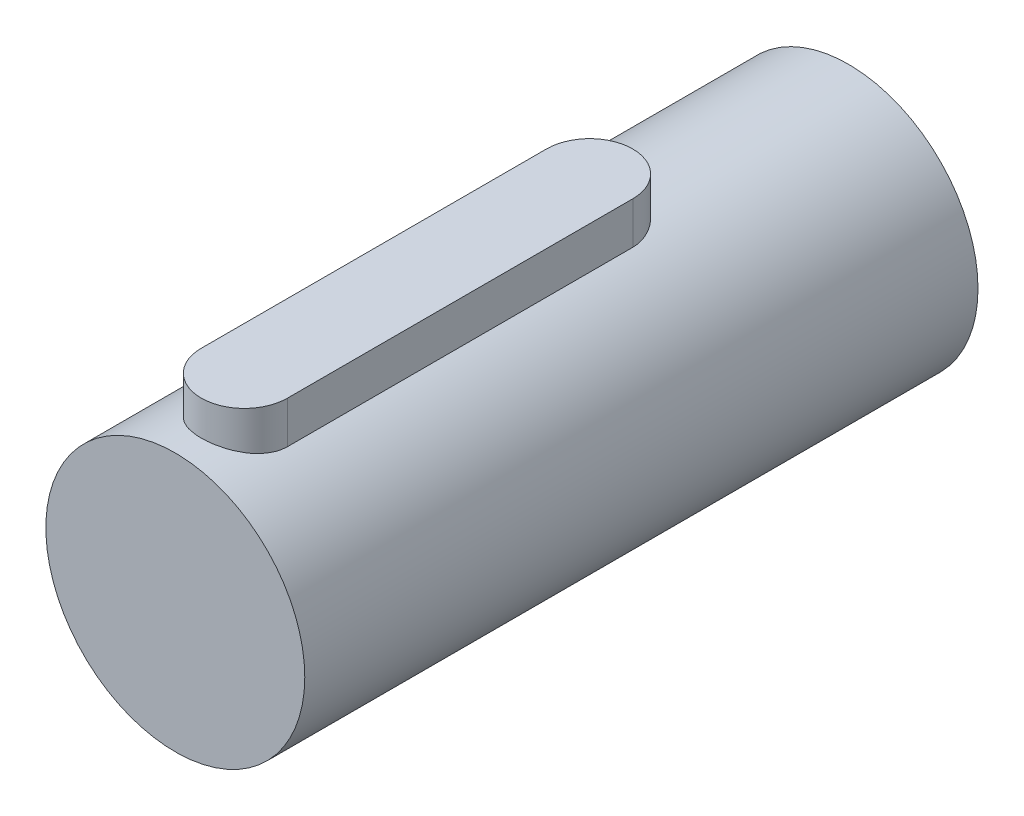
ISO-10303-21;
HEADER;
FILE_DESCRIPTION(('STEP AP214'),'2;1');
FILE_NAME('part.step','',(''),(''),'','','');
FILE_SCHEMA(('AUTOMOTIVE_DESIGN { 1 0 10303 214 1 1 1 1 }'));
ENDSEC;
DATA;
#1=APPLICATION_CONTEXT('core data for automotive mechanical design processes');
#2=APPLICATION_PROTOCOL_DEFINITION('international standard','automotive_design',2000,#1);
#3=PRODUCT_CONTEXT('',#1,'mechanical');
#4=PRODUCT('Part','Part','',(#3));
#5=PRODUCT_RELATED_PRODUCT_CATEGORY('part','',(#4));
#6=PRODUCT_DEFINITION_FORMATION('','',#4);
#7=PRODUCT_DEFINITION_CONTEXT('part definition',#1,'design');
#8=PRODUCT_DEFINITION('design','',#6,#7);
#9=PRODUCT_DEFINITION_SHAPE('','',#8);
#10=(LENGTH_UNIT() NAMED_UNIT(*) SI_UNIT(.MILLI.,.METRE.));
#11=(NAMED_UNIT(*) PLANE_ANGLE_UNIT() SI_UNIT($,.RADIAN.));
#12=(NAMED_UNIT(*) SI_UNIT($,.STERADIAN.) SOLID_ANGLE_UNIT());
#13=UNCERTAINTY_MEASURE_WITH_UNIT(LENGTH_MEASURE(1.E-05),#10,'distance_accuracy_value','');
#14=(GEOMETRIC_REPRESENTATION_CONTEXT(3) GLOBAL_UNCERTAINTY_ASSIGNED_CONTEXT((#13)) GLOBAL_UNIT_ASSIGNED_CONTEXT((#10,
#11,#12)) REPRESENTATION_CONTEXT('',''));
#15=CARTESIAN_POINT('',(0.,0.,0.));
#16=DIRECTION('',(0.,0.,1.));
#17=DIRECTION('',(1.,0.,0.));
#18=AXIS2_PLACEMENT_3D('',#15,#16,#17);
#19=CARTESIAN_POINT('',(1.31838984174237E-13,4.4999999999999,-24.));
#20=DIRECTION('',(0.,1.,0.));
#21=DIRECTION('',(0.,0.,0.999999999999998));
#22=AXIS2_PLACEMENT_3D('',#19,#20,#21);
#23=CYLINDRICAL_SURFACE('',#22,2.5);
#24=CARTESIAN_POINT('',(0.,9.49999999999996,-24.));
#25=DIRECTION('',(0.,1.,0.));
#26=DIRECTION('',(0.,0.,0.999999999999998));
#27=AXIS2_PLACEMENT_3D('',#24,#25,#26);
#28=CIRCLE('',#27,2.5);
#29=CARTESIAN_POINT('',(2.50000000000017,9.4999999999999,-24.));
#30=VERTEX_POINT('',#29);
#31=CARTESIAN_POINT('',(-2.49999999999999,9.49999999999999,-24.));
#32=VERTEX_POINT('',#31);
#33=EDGE_CURVE('E120',#30,#32,#28,.T.);
#34=ORIENTED_EDGE('',*,*,#33,.F.);
#35=DIRECTION('',(0.,1.,0.));
#36=VECTOR('',#35,1.);
#37=CARTESIAN_POINT('',(2.50000000000003,4.49999999999995,-24.));
#38=LINE('',#37,#36);
#39=CARTESIAN_POINT('',(2.50000000000003,4.49999999999995,-24.));
#40=VERTEX_POINT('',#39);
#41=EDGE_CURVE('E12',#40,#30,#38,.T.);
#42=ORIENTED_EDGE('',*,*,#41,.F.);
#43=CARTESIAN_POINT('',(1.31838984174237E-13,4.4999999999999,-24.));
#44=DIRECTION('',(0.,1.,0.));
#45=DIRECTION('',(0.,0.,0.999999999999998));
#46=AXIS2_PLACEMENT_3D('',#43,#44,#45);
#47=CIRCLE('',#46,2.5);
#48=CARTESIAN_POINT('',(-2.49999999999986,4.49999999999995,-24.));
#49=VERTEX_POINT('',#48);
#50=EDGE_CURVE('E111',#40,#49,#47,.T.);
#51=ORIENTED_EDGE('',*,*,#50,.T.);
#52=DIRECTION('',(0.,1.,0.));
#53=VECTOR('',#52,1.);
#54=CARTESIAN_POINT('',(-2.49999999999986,4.49999999999995,-24.));
#55=LINE('',#54,#53);
#56=EDGE_CURVE('E52',#49,#32,#55,.T.);
#57=ORIENTED_EDGE('',*,*,#56,.T.);
#58=EDGE_LOOP('',(#34,#42,#51,#57));
#59=FACE_BOUND('',#58,.T.);
#60=ADVANCED_FACE('F49',(#59),#23,.T.);
#61=CARTESIAN_POINT('',(2.50000000000003,4.49999999999995,-24.));
#62=DIRECTION('',(1.,0.,0.));
#63=DIRECTION('',(0.,0.,-0.999999999999998));
#64=AXIS2_PLACEMENT_3D('',#61,#62,#63);
#65=PLANE('',#64);
#66=DIRECTION('',(0.,0.,-0.999999999999998));
#67=VECTOR('',#66,1.);
#68=CARTESIAN_POINT('',(2.50000000000017,9.4999999999999,-24.));
#69=LINE('',#68,#67);
#70=CARTESIAN_POINT('',(2.49999999999996,9.49999999999993,-4.00000000000003));
#71=VERTEX_POINT('',#70);
#72=EDGE_CURVE('E115',#71,#30,#69,.T.);
#73=ORIENTED_EDGE('',*,*,#72,.F.);
#74=DIRECTION('',(0.,1.,0.));
#75=VECTOR('',#74,1.);
#76=CARTESIAN_POINT('',(2.50000000000013,4.49999999999995,-4.));
#77=LINE('',#76,#75);
#78=CARTESIAN_POINT('',(2.50000000000013,4.49999999999995,-4.));
#79=VERTEX_POINT('',#78);
#80=EDGE_CURVE('E59',#79,#71,#77,.T.);
#81=ORIENTED_EDGE('',*,*,#80,.F.);
#82=DIRECTION('',(0.,0.,-0.999999999999998));
#83=VECTOR('',#82,1.);
#84=CARTESIAN_POINT('',(2.50000000000003,4.49999999999995,-24.));
#85=LINE('',#84,#83);
#86=EDGE_CURVE('E106',#79,#40,#85,.T.);
#87=ORIENTED_EDGE('',*,*,#86,.T.);
#88=ORIENTED_EDGE('',*,*,#41,.T.);
#89=EDGE_LOOP('',(#73,#81,#87,#88));
#90=FACE_BOUND('',#89,.T.);
#91=ADVANCED_FACE('F142',(#90),#65,.T.);
#92=CARTESIAN_POINT('',(0.,4.49999999999992,-4.00000000000006));
#93=DIRECTION('',(0.,1.,0.));
#94=DIRECTION('',(0.,0.,0.999999999999998));
#95=AXIS2_PLACEMENT_3D('',#92,#93,#94);
#96=CYLINDRICAL_SURFACE('',#95,2.5);
#97=CARTESIAN_POINT('',(0.,9.49999999999998,-4.00000000000006));
#98=DIRECTION('',(0.,1.,0.));
#99=DIRECTION('',(0.,0.,0.999999999999998));
#100=AXIS2_PLACEMENT_3D('',#97,#98,#99);
#101=CIRCLE('',#100,2.5);
#102=CARTESIAN_POINT('',(-2.49999999999997,9.50000000000001,-4.00000000000006));
#103=VERTEX_POINT('',#102);
#104=EDGE_CURVE('E100',#103,#71,#101,.T.);
#105=ORIENTED_EDGE('',*,*,#104,.F.);
#106=DIRECTION('',(0.,1.,0.));
#107=VECTOR('',#106,1.);
#108=CARTESIAN_POINT('',(-2.49999999999998,4.50000000000001,-4.));
#109=LINE('',#108,#107);
#110=CARTESIAN_POINT('',(-2.49999999999998,4.50000000000001,-4.));
#111=VERTEX_POINT('',#110);
#112=EDGE_CURVE('E95',#111,#103,#109,.T.);
#113=ORIENTED_EDGE('',*,*,#112,.F.);
#114=CARTESIAN_POINT('',(0.,4.49999999999992,-4.00000000000006));
#115=DIRECTION('',(0.,1.,0.));
#116=DIRECTION('',(0.,0.,0.999999999999998));
#117=AXIS2_PLACEMENT_3D('',#114,#115,#116);
#118=CIRCLE('',#117,2.5);
#119=EDGE_CURVE('E98',#111,#79,#118,.T.);
#120=ORIENTED_EDGE('',*,*,#119,.T.);
#121=ORIENTED_EDGE('',*,*,#80,.T.);
#122=EDGE_LOOP('',(#105,#113,#120,#121));
#123=FACE_BOUND('',#122,.T.);
#124=ADVANCED_FACE('F97',(#123),#96,.T.);
#125=CARTESIAN_POINT('',(-2.49999999999986,4.49999999999995,-24.));
#126=DIRECTION('',(-1.,0.,0.));
#127=DIRECTION('',(0.,0.,0.999999999999998));
#128=AXIS2_PLACEMENT_3D('',#125,#126,#127);
#129=PLANE('',#128);
#130=DIRECTION('',(0.,0.,0.999999999999998));
#131=VECTOR('',#130,1.);
#132=CARTESIAN_POINT('',(-2.49999999999999,9.49999999999999,-24.));
#133=LINE('',#132,#131);
#134=EDGE_CURVE('E124',#32,#103,#133,.T.);
#135=ORIENTED_EDGE('',*,*,#134,.F.);
#136=ORIENTED_EDGE('',*,*,#56,.F.);
#137=DIRECTION('',(0.,0.,0.999999999999998));
#138=VECTOR('',#137,1.);
#139=CARTESIAN_POINT('',(-2.49999999999986,4.49999999999995,-24.));
#140=LINE('',#139,#138);
#141=EDGE_CURVE('E105',#49,#111,#140,.T.);
#142=ORIENTED_EDGE('',*,*,#141,.T.);
#143=ORIENTED_EDGE('',*,*,#112,.T.);
#144=EDGE_LOOP('',(#135,#136,#142,#143));
#145=FACE_BOUND('',#144,.T.);
#146=ADVANCED_FACE('F109',(#145),#129,.T.);
#147=CARTESIAN_POINT('',(1.31838984174237E-13,4.4999999999999,-24.));
#148=DIRECTION('',(0.,1.,0.));
#149=DIRECTION('',(0.,0.,0.999999999999998));
#150=AXIS2_PLACEMENT_3D('',#147,#148,#149);
#151=PLANE('',#150);
#152=ORIENTED_EDGE('',*,*,#50,.F.);
#153=ORIENTED_EDGE('',*,*,#86,.F.);
#154=ORIENTED_EDGE('',*,*,#119,.F.);
#155=ORIENTED_EDGE('',*,*,#141,.F.);
#156=EDGE_LOOP('',(#152,#153,#154,#155));
#157=FACE_BOUND('',#156,.T.);
#158=ADVANCED_FACE('F104',(#157),#151,.F.);
#159=CARTESIAN_POINT('',(0.,9.49999999999996,-24.));
#160=DIRECTION('',(0.,1.,0.));
#161=DIRECTION('',(0.,0.,0.999999999999998));
#162=AXIS2_PLACEMENT_3D('',#159,#160,#161);
#163=PLANE('',#162);
#164=ORIENTED_EDGE('',*,*,#33,.T.);
#165=ORIENTED_EDGE('',*,*,#134,.T.);
#166=ORIENTED_EDGE('',*,*,#104,.T.);
#167=ORIENTED_EDGE('',*,*,#72,.T.);
#168=EDGE_LOOP('',(#164,#165,#166,#167));
#169=FACE_BOUND('',#168,.T.);
#170=ADVANCED_FACE('F141',(#169),#163,.T.);
#171=CLOSED_SHELL('',(#60,#91,#124,#146,#158,#170));
#172=MANIFOLD_SOLID_BREP('B2',#171);
#173=CARTESIAN_POINT('',(0.,-1.23165366794353E-13,-38.9999999999999));
#174=DIRECTION('',(0.,0.,0.999999999999998));
#175=DIRECTION('',(1.,0.,0.));
#176=AXIS2_PLACEMENT_3D('',#173,#174,#175);
#177=CYLINDRICAL_SURFACE('',#176,7.5);
#178=CARTESIAN_POINT('',(0.,-1.23165366794353E-13,-38.9999999999999));
#179=DIRECTION('',(0.,0.,0.999999999999998));
#180=DIRECTION('',(1.,0.,0.));
#181=AXIS2_PLACEMENT_3D('',#178,#179,#180);
#182=CIRCLE('',#181,7.5);
#183=CARTESIAN_POINT('',(7.5,-1.26287869051112E-13,-38.9999999999999));
#184=VERTEX_POINT('',#183);
#185=EDGE_CURVE('E48',#184,#184,#182,.T.);
#186=CARTESIAN_POINT('',(0.,0.,0.));
#187=DIRECTION('',(0.,0.,0.999999999999998));
#188=DIRECTION('',(1.,0.,0.));
#189=AXIS2_PLACEMENT_3D('',#186,#187,#188);
#190=CIRCLE('',#189,7.5);
#191=CARTESIAN_POINT('',(7.5,-1.28452803949131E-13,0.));
#192=VERTEX_POINT('',#191);
#193=EDGE_CURVE('E200',#192,#192,#190,.T.);
#194=CARTESIAN_POINT('',(7.5,-1.26287869051112E-13,-38.9999999999999));
#195=CARTESIAN_POINT('',(7.5,-1.26310420456299E-13,-38.5937499999999));
#196=CARTESIAN_POINT('',(7.5,-1.26332971861487E-13,-38.1874999999999));
#197=CARTESIAN_POINT('',(7.5,-1.26378074671862E-13,-37.3749999999999));
#198=CARTESIAN_POINT('',(7.5,-1.2640062607705E-13,-36.9687499999999));
#199=CARTESIAN_POINT('',(7.5,-1.26445728887425E-13,-36.1562499999999));
#200=CARTESIAN_POINT('',(7.5,-1.26468280292613E-13,-35.7499999999999));
#201=CARTESIAN_POINT('',(7.5,-1.26513383102989E-13,-34.9375));
#202=CARTESIAN_POINT('',(7.5,-1.26535934508176E-13,-34.5312499999999));
#203=CARTESIAN_POINT('',(7.5,-1.26581037318552E-13,-33.71875));
#204=CARTESIAN_POINT('',(7.5,-1.26603588723739E-13,-33.3124999999999));
#205=CARTESIAN_POINT('',(7.5,-1.26648691534115E-13,-32.5));
#206=CARTESIAN_POINT('',(7.5,-1.26671242939302E-13,-32.09375));
#207=CARTESIAN_POINT('',(7.5,-1.26716345749678E-13,-31.28125));
#208=CARTESIAN_POINT('',(7.5,-1.26738897154866E-13,-30.875));
#209=CARTESIAN_POINT('',(7.5,-1.26783999965241E-13,-30.0625));
#210=CARTESIAN_POINT('',(7.5,-1.26806551370429E-13,-29.65625));
#211=CARTESIAN_POINT('',(7.5,-1.26851654180804E-13,-28.84375));
#212=CARTESIAN_POINT('',(7.5,-1.26874205585992E-13,-28.4375));
#213=CARTESIAN_POINT('',(7.5,-1.26919308396367E-13,-27.625));
#214=CARTESIAN_POINT('',(7.5,-1.26941859801555E-13,-27.21875));
#215=CARTESIAN_POINT('',(7.5,-1.2698696261193E-13,-26.40625));
#216=CARTESIAN_POINT('',(7.5,-1.27009514017118E-13,-26.));
#217=CARTESIAN_POINT('',(7.5,-1.27054616827493E-13,-25.1875));
#218=CARTESIAN_POINT('',(7.5,-1.27077168232681E-13,-24.78125));
#219=CARTESIAN_POINT('',(7.5,-1.27122271043056E-13,-23.96875));
#220=CARTESIAN_POINT('',(7.5,-1.27144822448244E-13,-23.5625));
#221=CARTESIAN_POINT('',(7.5,-1.2718992525862E-13,-22.75));
#222=CARTESIAN_POINT('',(7.5,-1.27212476663807E-13,-22.34375));
#223=CARTESIAN_POINT('',(7.5,-1.27257579474183E-13,-21.53125));
#224=CARTESIAN_POINT('',(7.5,-1.2728013087937E-13,-21.125));
#225=CARTESIAN_POINT('',(7.5,-1.27325233689746E-13,-20.3125));
#226=CARTESIAN_POINT('',(7.5,-1.27347785094933E-13,-19.90625));
#227=CARTESIAN_POINT('',(7.5,-1.27392887905309E-13,-19.09375));
#228=CARTESIAN_POINT('',(7.5,-1.27415439310496E-13,-18.6875));
#229=CARTESIAN_POINT('',(7.5,-1.27460542120872E-13,-17.875));
#230=CARTESIAN_POINT('',(7.5,-1.2748309352606E-13,-17.46875));
#231=CARTESIAN_POINT('',(7.5,-1.27528196336435E-13,-16.65625));
#232=CARTESIAN_POINT('',(7.5,-1.27550747741623E-13,-16.25));
#233=CARTESIAN_POINT('',(7.5,-1.27595850551998E-13,-15.4375));
#234=CARTESIAN_POINT('',(7.5,-1.27618401957186E-13,-15.03125));
#235=CARTESIAN_POINT('',(7.5,-1.27663504767561E-13,-14.21875));
#236=CARTESIAN_POINT('',(7.5,-1.27686056172749E-13,-13.8125));
#237=CARTESIAN_POINT('',(7.5,-1.27731158983124E-13,-13.));
#238=CARTESIAN_POINT('',(7.5,-1.27753710388312E-13,-12.59375));
#239=CARTESIAN_POINT('',(7.5,-1.27798813198687E-13,-11.78125));
#240=CARTESIAN_POINT('',(7.5,-1.27821364603875E-13,-11.375));
#241=CARTESIAN_POINT('',(7.5,-1.2786646741425E-13,-10.5625));
#242=CARTESIAN_POINT('',(7.5,-1.27889018819438E-13,-10.15625));
#243=CARTESIAN_POINT('',(7.5,-1.27934121629814E-13,-9.34374999999998));
#244=CARTESIAN_POINT('',(7.5,-1.27956673035001E-13,-8.93749999999998));
#245=CARTESIAN_POINT('',(7.5,-1.28001775845377E-13,-8.12499999999998));
#246=CARTESIAN_POINT('',(7.5,-1.28024327250564E-13,-7.71874999999998));
#247=CARTESIAN_POINT('',(7.5,-1.2806943006094E-13,-6.90624999999999));
#248=CARTESIAN_POINT('',(7.5,-1.28091981466127E-13,-6.49999999999999));
#249=CARTESIAN_POINT('',(7.5,-1.28137084276503E-13,-5.68749999999999));
#250=CARTESIAN_POINT('',(7.5,-1.28159635681691E-13,-5.28124999999999));
#251=CARTESIAN_POINT('',(7.5,-1.28204738492066E-13,-4.46874999999999));
#252=CARTESIAN_POINT('',(7.5,-1.28227289897254E-13,-4.06249999999999));
#253=CARTESIAN_POINT('',(7.5,-1.28272392707629E-13,-3.24999999999999));
#254=CARTESIAN_POINT('',(7.5,-1.28294944112817E-13,-2.84374999999999));
#255=CARTESIAN_POINT('',(7.5,-1.28340046923192E-13,-2.03125));
#256=CARTESIAN_POINT('',(7.5,-1.2836259832838E-13,-1.625));
#257=CARTESIAN_POINT('',(7.5,-1.28407701138755E-13,-0.812499999999998));
#258=CARTESIAN_POINT('',(7.5,-1.28430252543943E-13,-0.406249999999999));
#259=CARTESIAN_POINT('',(7.5,-1.28452803949131E-13,0.));
#260=B_SPLINE_CURVE_WITH_KNOTS('',3,(#194,#195,#196,#197,#198,#199,#200,#201,#202,#203,#204,
#205,#206,#207,#208,#209,#210,#211,#212,#213,#214,#215,#216,#217,#218,#219,#220,#221,#222,#223,
#224,#225,#226,#227,#228,#229,#230,#231,#232,#233,#234,#235,#236,#237,#238,#239,#240,#241,#242,
#243,#244,#245,#246,#247,#248,#249,#250,#251,#252,#253,#254,#255,#256,#257,#258,#259),
.UNSPECIFIED.,.F.,.F.,(4,2,2,2,2,2,2,2,2,2,2,2,2,2,2,2,2,2,2,2,2,2,2,2,2,2,2,2,2,2,2,2,4),(0.,
1.21875,2.4375,3.65625,4.875,6.09374999999999,7.31249999999999,8.53124999999999,
9.74999999999999,10.96875,12.1875,13.40625,14.625,15.84375,17.0625,18.28125,19.5,20.71875,
21.9375,23.15625,24.375,25.59375,26.8125,28.03125,29.25,30.46875,31.6875,32.90625,34.125,
35.34375,36.5625,37.78125,38.9999999999999),.UNSPECIFIED.);
#261=EDGE_CURVE('BSEAM197',#184,#192,#260,.T.);
#262=ORIENTED_EDGE('',*,*,#185,.T.);
#263=ORIENTED_EDGE('',*,*,#193,.F.);
#264=ORIENTED_EDGE('',*,*,#261,.T.);
#265=ORIENTED_EDGE('',*,*,#261,.F.);
#266=EDGE_LOOP('',(#262,#264,#263,#265));
#267=FACE_BOUND('',#266,.T.);
#268=ADVANCED_FACE('F197',(#267),#177,.T.);
#269=CARTESIAN_POINT('',(0.,-1.23165366794353E-13,-38.9999999999999));
#270=DIRECTION('',(0.,0.,0.999999999999998));
#271=DIRECTION('',(1.,0.,0.));
#272=AXIS2_PLACEMENT_3D('',#269,#270,#271);
#273=PLANE('',#272);
#274=ORIENTED_EDGE('',*,*,#185,.F.);
#275=EDGE_LOOP('',(#274));
#276=FACE_BOUND('',#275,.T.);
#277=ADVANCED_FACE('F216',(#276),#273,.F.);
#278=CARTESIAN_POINT('',(0.,0.,0.));
#279=DIRECTION('',(0.,0.,0.999999999999998));
#280=DIRECTION('',(1.,0.,0.));
#281=AXIS2_PLACEMENT_3D('',#278,#279,#280);
#282=PLANE('',#281);
#283=ORIENTED_EDGE('',*,*,#193,.T.);
#284=EDGE_LOOP('',(#283));
#285=FACE_BOUND('',#284,.T.);
#286=ADVANCED_FACE('F213',(#285),#282,.T.);
#287=CLOSED_SHELL('',(#268,#277,#286));
#288=MANIFOLD_SOLID_BREP('B6',#287);
#289=ADVANCED_BREP_SHAPE_REPRESENTATION('',(#18,#172,#288),#14);
#290=SHAPE_DEFINITION_REPRESENTATION(#9,#289);
ENDSEC;
END-ISO-10303-21;
